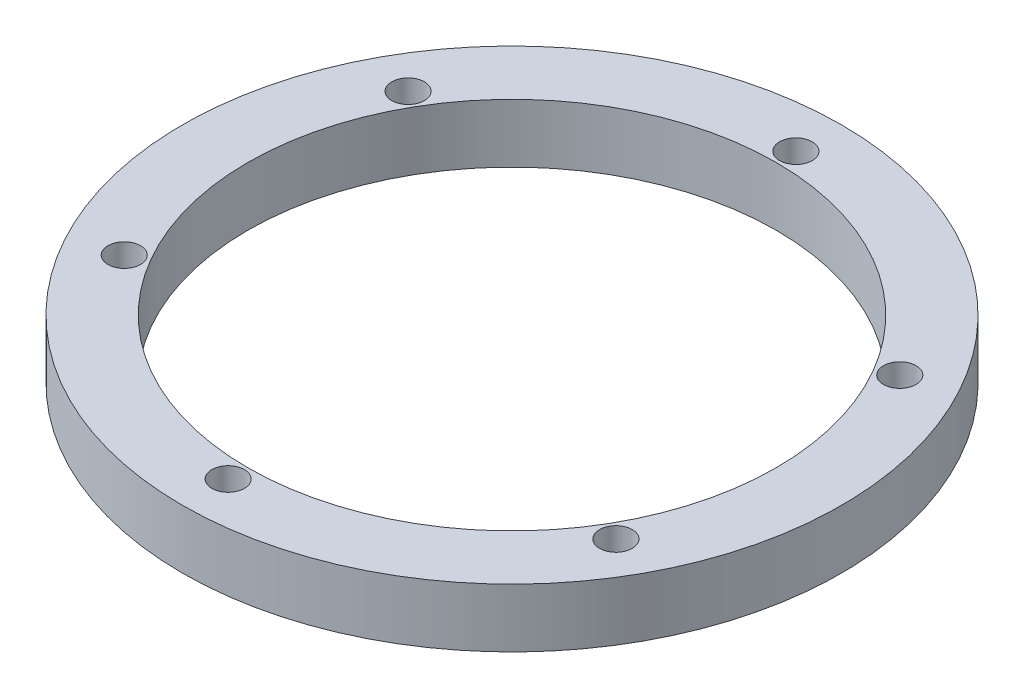
ISO-10303-21;
HEADER;
FILE_DESCRIPTION(('STEP AP214'),'2;1');
FILE_NAME('part.step','',(''),(''),'','','');
FILE_SCHEMA(('AUTOMOTIVE_DESIGN { 1 0 10303 214 1 1 1 1 }'));
ENDSEC;
DATA;
#1=APPLICATION_CONTEXT('core data for automotive mechanical design processes');
#2=APPLICATION_PROTOCOL_DEFINITION('international standard','automotive_design',2000,#1);
#3=PRODUCT_CONTEXT('',#1,'mechanical');
#4=PRODUCT('Part','Part','',(#3));
#5=PRODUCT_RELATED_PRODUCT_CATEGORY('part','',(#4));
#6=PRODUCT_DEFINITION_FORMATION('','',#4);
#7=PRODUCT_DEFINITION_CONTEXT('part definition',#1,'design');
#8=PRODUCT_DEFINITION('design','',#6,#7);
#9=PRODUCT_DEFINITION_SHAPE('','',#8);
#10=(LENGTH_UNIT() NAMED_UNIT(*) SI_UNIT(.MILLI.,.METRE.));
#11=(NAMED_UNIT(*) PLANE_ANGLE_UNIT() SI_UNIT($,.RADIAN.));
#12=(NAMED_UNIT(*) SI_UNIT($,.STERADIAN.) SOLID_ANGLE_UNIT());
#13=UNCERTAINTY_MEASURE_WITH_UNIT(LENGTH_MEASURE(1.E-05),#10,'distance_accuracy_value','');
#14=(GEOMETRIC_REPRESENTATION_CONTEXT(3) GLOBAL_UNCERTAINTY_ASSIGNED_CONTEXT((#13)) GLOBAL_UNIT_ASSIGNED_CONTEXT((#10,
#11,#12)) REPRESENTATION_CONTEXT('',''));
#15=CARTESIAN_POINT('',(0.,0.,0.));
#16=DIRECTION('',(0.,0.,1.));
#17=DIRECTION('',(1.,0.,0.));
#18=AXIS2_PLACEMENT_3D('',#15,#16,#17);
#19=CARTESIAN_POINT('',(0.,9.,0.));
#20=DIRECTION('',(0.,1.,0.));
#21=DIRECTION('',(0.,0.,1.));
#22=AXIS2_PLACEMENT_3D('',#19,#20,#21);
#23=PLANE('',#22);
#24=CARTESIAN_POINT('',(0.,9.,-43.5));
#25=DIRECTION('',(0.,1.,0.));
#26=DIRECTION('',(0.,0.,1.));
#27=AXIS2_PLACEMENT_3D('',#24,#25,#26);
#28=CIRCLE('',#27,2.5);
#29=CARTESIAN_POINT('',(0.,9.,-41.));
#30=VERTEX_POINT('',#29);
#31=EDGE_CURVE('E99',#30,#30,#28,.T.);
#32=ORIENTED_EDGE('',*,*,#31,.F.);
#33=EDGE_LOOP('',(#32));
#34=FACE_BOUND('',#33,.T.);
#35=CARTESIAN_POINT('',(-37.6721050646231,9.,-21.75));
#36=DIRECTION('',(0.,1.,0.));
#37=DIRECTION('',(0.,0.,1.));
#38=AXIS2_PLACEMENT_3D('',#35,#36,#37);
#39=CIRCLE('',#38,2.5);
#40=CARTESIAN_POINT('',(-37.6721050646231,9.,-19.25));
#41=VERTEX_POINT('',#40);
#42=EDGE_CURVE('E100',#41,#41,#39,.T.);
#43=ORIENTED_EDGE('',*,*,#42,.F.);
#44=EDGE_LOOP('',(#43));
#45=FACE_BOUND('',#44,.T.);
#46=CARTESIAN_POINT('',(-37.6721050646231,9.,21.75));
#47=DIRECTION('',(0.,1.,0.));
#48=DIRECTION('',(0.,0.,1.));
#49=AXIS2_PLACEMENT_3D('',#46,#47,#48);
#50=CIRCLE('',#49,2.5);
#51=CARTESIAN_POINT('',(-37.6721050646231,9.,24.25));
#52=VERTEX_POINT('',#51);
#53=EDGE_CURVE('E66',#52,#52,#50,.T.);
#54=ORIENTED_EDGE('',*,*,#53,.F.);
#55=EDGE_LOOP('',(#54));
#56=FACE_BOUND('',#55,.T.);
#57=CARTESIAN_POINT('',(0.,9.,43.5));
#58=DIRECTION('',(0.,1.,0.));
#59=DIRECTION('',(0.,0.,1.));
#60=AXIS2_PLACEMENT_3D('',#57,#58,#59);
#61=CIRCLE('',#60,2.5);
#62=CARTESIAN_POINT('',(0.,9.,46.));
#63=VERTEX_POINT('',#62);
#64=EDGE_CURVE('E75',#63,#63,#61,.T.);
#65=ORIENTED_EDGE('',*,*,#64,.F.);
#66=EDGE_LOOP('',(#65));
#67=FACE_BOUND('',#66,.T.);
#68=CARTESIAN_POINT('',(37.6721050646231,9.,21.75));
#69=DIRECTION('',(0.,1.,0.));
#70=DIRECTION('',(0.,0.,1.));
#71=AXIS2_PLACEMENT_3D('',#68,#69,#70);
#72=CIRCLE('',#71,2.5);
#73=CARTESIAN_POINT('',(37.6721050646231,9.,24.25));
#74=VERTEX_POINT('',#73);
#75=EDGE_CURVE('E83',#74,#74,#72,.T.);
#76=ORIENTED_EDGE('',*,*,#75,.F.);
#77=EDGE_LOOP('',(#76));
#78=FACE_BOUND('',#77,.T.);
#79=CARTESIAN_POINT('',(37.6721050646231,9.,-21.75));
#80=DIRECTION('',(0.,1.,0.));
#81=DIRECTION('',(0.,0.,1.));
#82=AXIS2_PLACEMENT_3D('',#79,#80,#81);
#83=CIRCLE('',#82,2.5);
#84=CARTESIAN_POINT('',(37.6721050646231,9.,-19.25));
#85=VERTEX_POINT('',#84);
#86=EDGE_CURVE('E91',#85,#85,#83,.T.);
#87=ORIENTED_EDGE('',*,*,#86,.F.);
#88=EDGE_LOOP('',(#87));
#89=FACE_BOUND('',#88,.T.);
#90=CARTESIAN_POINT('',(0.,9.,0.));
#91=DIRECTION('',(0.,1.,0.));
#92=DIRECTION('',(0.,0.,1.));
#93=AXIS2_PLACEMENT_3D('',#90,#91,#92);
#94=CIRCLE('',#93,50.5);
#95=CARTESIAN_POINT('',(0.,9.,50.5));
#96=VERTEX_POINT('',#95);
#97=EDGE_CURVE('E10',#96,#96,#94,.T.);
#98=ORIENTED_EDGE('',*,*,#97,.T.);
#99=EDGE_LOOP('',(#98));
#100=FACE_BOUND('',#99,.T.);
#101=CARTESIAN_POINT('',(0.,9.,0.));
#102=DIRECTION('',(0.,1.,0.));
#103=DIRECTION('',(0.,0.,1.));
#104=AXIS2_PLACEMENT_3D('',#101,#102,#103);
#105=CIRCLE('',#104,40.5);
#106=CARTESIAN_POINT('',(0.,9.,40.5));
#107=VERTEX_POINT('',#106);
#108=EDGE_CURVE('E56',#107,#107,#105,.T.);
#109=ORIENTED_EDGE('',*,*,#108,.F.);
#110=EDGE_LOOP('',(#109));
#111=FACE_BOUND('',#110,.T.);
#112=ADVANCED_FACE('F43',(#34,#45,#56,#67,#78,#89,#100,#111),#23,.T.);
#113=CARTESIAN_POINT('',(0.,0.,0.));
#114=DIRECTION('',(0.,1.,0.));
#115=DIRECTION('',(0.,0.,1.));
#116=AXIS2_PLACEMENT_3D('',#113,#114,#115);
#117=PLANE('',#116);
#118=CARTESIAN_POINT('',(0.,0.,-43.5));
#119=DIRECTION('',(0.,1.,0.));
#120=DIRECTION('',(0.,0.,1.));
#121=AXIS2_PLACEMENT_3D('',#118,#119,#120);
#122=CIRCLE('',#121,2.5);
#123=CARTESIAN_POINT('',(0.,0.,-41.));
#124=VERTEX_POINT('',#123);
#125=EDGE_CURVE('E62',#124,#124,#122,.T.);
#126=ORIENTED_EDGE('',*,*,#125,.T.);
#127=EDGE_LOOP('',(#126));
#128=FACE_BOUND('',#127,.T.);
#129=CARTESIAN_POINT('',(-37.6721050646231,0.,-21.75));
#130=DIRECTION('',(0.,1.,0.));
#131=DIRECTION('',(0.,0.,1.));
#132=AXIS2_PLACEMENT_3D('',#129,#130,#131);
#133=CIRCLE('',#132,2.5);
#134=CARTESIAN_POINT('',(-37.6721050646231,0.,-19.25));
#135=VERTEX_POINT('',#134);
#136=EDGE_CURVE('E71',#135,#135,#133,.T.);
#137=ORIENTED_EDGE('',*,*,#136,.T.);
#138=EDGE_LOOP('',(#137));
#139=FACE_BOUND('',#138,.T.);
#140=CARTESIAN_POINT('',(-37.6721050646231,0.,21.75));
#141=DIRECTION('',(0.,1.,0.));
#142=DIRECTION('',(0.,0.,1.));
#143=AXIS2_PLACEMENT_3D('',#140,#141,#142);
#144=CIRCLE('',#143,2.5);
#145=CARTESIAN_POINT('',(-37.6721050646231,0.,24.25));
#146=VERTEX_POINT('',#145);
#147=EDGE_CURVE('E70',#146,#146,#144,.T.);
#148=ORIENTED_EDGE('',*,*,#147,.T.);
#149=EDGE_LOOP('',(#148));
#150=FACE_BOUND('',#149,.T.);
#151=CARTESIAN_POINT('',(0.,0.,43.5));
#152=DIRECTION('',(0.,1.,0.));
#153=DIRECTION('',(0.,0.,1.));
#154=AXIS2_PLACEMENT_3D('',#151,#152,#153);
#155=CIRCLE('',#154,2.5);
#156=CARTESIAN_POINT('',(0.,0.,46.));
#157=VERTEX_POINT('',#156);
#158=EDGE_CURVE('E79',#157,#157,#155,.T.);
#159=ORIENTED_EDGE('',*,*,#158,.T.);
#160=EDGE_LOOP('',(#159));
#161=FACE_BOUND('',#160,.T.);
#162=CARTESIAN_POINT('',(37.6721050646231,0.,21.75));
#163=DIRECTION('',(0.,1.,0.));
#164=DIRECTION('',(0.,0.,1.));
#165=AXIS2_PLACEMENT_3D('',#162,#163,#164);
#166=CIRCLE('',#165,2.5);
#167=CARTESIAN_POINT('',(37.6721050646231,0.,24.25));
#168=VERTEX_POINT('',#167);
#169=EDGE_CURVE('E87',#168,#168,#166,.T.);
#170=ORIENTED_EDGE('',*,*,#169,.T.);
#171=EDGE_LOOP('',(#170));
#172=FACE_BOUND('',#171,.T.);
#173=CARTESIAN_POINT('',(37.6721050646231,0.,-21.75));
#174=DIRECTION('',(0.,1.,0.));
#175=DIRECTION('',(0.,0.,1.));
#176=AXIS2_PLACEMENT_3D('',#173,#174,#175);
#177=CIRCLE('',#176,2.5);
#178=CARTESIAN_POINT('',(37.6721050646231,0.,-19.25));
#179=VERTEX_POINT('',#178);
#180=EDGE_CURVE('E95',#179,#179,#177,.T.);
#181=ORIENTED_EDGE('',*,*,#180,.T.);
#182=EDGE_LOOP('',(#181));
#183=FACE_BOUND('',#182,.T.);
#184=CARTESIAN_POINT('',(0.,0.,0.));
#185=DIRECTION('',(0.,1.,0.));
#186=DIRECTION('',(0.,0.,1.));
#187=AXIS2_PLACEMENT_3D('',#184,#185,#186);
#188=CIRCLE('',#187,50.5);
#189=CARTESIAN_POINT('',(0.,0.,50.5));
#190=VERTEX_POINT('',#189);
#191=EDGE_CURVE('E47',#190,#190,#188,.T.);
#192=ORIENTED_EDGE('',*,*,#191,.F.);
#193=EDGE_LOOP('',(#192));
#194=FACE_BOUND('',#193,.T.);
#195=CARTESIAN_POINT('',(0.,0.,0.));
#196=DIRECTION('',(0.,1.,0.));
#197=DIRECTION('',(0.,0.,1.));
#198=AXIS2_PLACEMENT_3D('',#195,#196,#197);
#199=CIRCLE('',#198,40.5);
#200=CARTESIAN_POINT('',(0.,0.,40.5));
#201=VERTEX_POINT('',#200);
#202=EDGE_CURVE('E58',#201,#201,#199,.T.);
#203=ORIENTED_EDGE('',*,*,#202,.T.);
#204=EDGE_LOOP('',(#203));
#205=FACE_BOUND('',#204,.T.);
#206=ADVANCED_FACE('F114',(#128,#139,#150,#161,#172,#183,#194,#205),#117,.F.);
#207=CARTESIAN_POINT('',(0.,9.,0.));
#208=DIRECTION('',(0.,-1.,0.));
#209=DIRECTION('',(0.,0.,-1.));
#210=AXIS2_PLACEMENT_3D('',#207,#208,#209);
#211=CYLINDRICAL_SURFACE('',#210,50.5);
#212=ORIENTED_EDGE('',*,*,#97,.F.);
#213=EDGE_LOOP('',(#212));
#214=FACE_BOUND('',#213,.T.);
#215=ORIENTED_EDGE('',*,*,#191,.T.);
#216=EDGE_LOOP('',(#215));
#217=FACE_BOUND('',#216,.T.);
#218=ADVANCED_FACE('F45',(#214,#217),#211,.T.);
#219=CARTESIAN_POINT('',(0.,9.,0.));
#220=DIRECTION('',(0.,-1.,0.));
#221=DIRECTION('',(0.,0.,-1.));
#222=AXIS2_PLACEMENT_3D('',#219,#220,#221);
#223=CYLINDRICAL_SURFACE('',#222,40.5);
#224=ORIENTED_EDGE('',*,*,#108,.T.);
#225=EDGE_LOOP('',(#224));
#226=FACE_BOUND('',#225,.T.);
#227=ORIENTED_EDGE('',*,*,#202,.F.);
#228=EDGE_LOOP('',(#227));
#229=FACE_BOUND('',#228,.T.);
#230=ADVANCED_FACE('F139',(#226,#229),#223,.F.);
#231=CARTESIAN_POINT('',(37.6721050646231,0.,-21.75));
#232=DIRECTION('',(0.,1.,0.));
#233=DIRECTION('',(0.,0.,1.));
#234=AXIS2_PLACEMENT_3D('',#231,#232,#233);
#235=CYLINDRICAL_SURFACE('',#234,2.5);
#236=ORIENTED_EDGE('',*,*,#180,.F.);
#237=EDGE_LOOP('',(#236));
#238=FACE_BOUND('',#237,.T.);
#239=ORIENTED_EDGE('',*,*,#86,.T.);
#240=EDGE_LOOP('',(#239));
#241=FACE_BOUND('',#240,.T.);
#242=ADVANCED_FACE('F142',(#238,#241),#235,.F.);
#243=CARTESIAN_POINT('',(37.6721050646231,0.,21.75));
#244=DIRECTION('',(0.,1.,0.));
#245=DIRECTION('',(0.,0.,1.));
#246=AXIS2_PLACEMENT_3D('',#243,#244,#245);
#247=CYLINDRICAL_SURFACE('',#246,2.5);
#248=ORIENTED_EDGE('',*,*,#169,.F.);
#249=EDGE_LOOP('',(#248));
#250=FACE_BOUND('',#249,.T.);
#251=ORIENTED_EDGE('',*,*,#75,.T.);
#252=EDGE_LOOP('',(#251));
#253=FACE_BOUND('',#252,.T.);
#254=ADVANCED_FACE('F160',(#250,#253),#247,.F.);
#255=CARTESIAN_POINT('',(0.,0.,43.5));
#256=DIRECTION('',(0.,1.,0.));
#257=DIRECTION('',(0.,0.,1.));
#258=AXIS2_PLACEMENT_3D('',#255,#256,#257);
#259=CYLINDRICAL_SURFACE('',#258,2.5);
#260=ORIENTED_EDGE('',*,*,#158,.F.);
#261=EDGE_LOOP('',(#260));
#262=FACE_BOUND('',#261,.T.);
#263=ORIENTED_EDGE('',*,*,#64,.T.);
#264=EDGE_LOOP('',(#263));
#265=FACE_BOUND('',#264,.T.);
#266=ADVANCED_FACE('F156',(#262,#265),#259,.F.);
#267=CARTESIAN_POINT('',(-37.6721050646231,0.,21.75));
#268=DIRECTION('',(0.,1.,0.));
#269=DIRECTION('',(0.,0.,1.));
#270=AXIS2_PLACEMENT_3D('',#267,#268,#269);
#271=CYLINDRICAL_SURFACE('',#270,2.5);
#272=ORIENTED_EDGE('',*,*,#147,.F.);
#273=EDGE_LOOP('',(#272));
#274=FACE_BOUND('',#273,.T.);
#275=ORIENTED_EDGE('',*,*,#53,.T.);
#276=EDGE_LOOP('',(#275));
#277=FACE_BOUND('',#276,.T.);
#278=ADVANCED_FACE('F153',(#274,#277),#271,.F.);
#279=CARTESIAN_POINT('',(-37.6721050646231,0.,-21.75));
#280=DIRECTION('',(0.,1.,0.));
#281=DIRECTION('',(0.,0.,1.));
#282=AXIS2_PLACEMENT_3D('',#279,#280,#281);
#283=CYLINDRICAL_SURFACE('',#282,2.5);
#284=ORIENTED_EDGE('',*,*,#136,.F.);
#285=EDGE_LOOP('',(#284));
#286=FACE_BOUND('',#285,.T.);
#287=ORIENTED_EDGE('',*,*,#42,.T.);
#288=EDGE_LOOP('',(#287));
#289=FACE_BOUND('',#288,.T.);
#290=ADVANCED_FACE('F120',(#286,#289),#283,.F.);
#291=CARTESIAN_POINT('',(0.,0.,-43.5));
#292=DIRECTION('',(0.,1.,0.));
#293=DIRECTION('',(0.,0.,1.));
#294=AXIS2_PLACEMENT_3D('',#291,#292,#293);
#295=CYLINDRICAL_SURFACE('',#294,2.5);
#296=ORIENTED_EDGE('',*,*,#125,.F.);
#297=EDGE_LOOP('',(#296));
#298=FACE_BOUND('',#297,.T.);
#299=ORIENTED_EDGE('',*,*,#31,.T.);
#300=EDGE_LOOP('',(#299));
#301=FACE_BOUND('',#300,.T.);
#302=ADVANCED_FACE('F117',(#298,#301),#295,.F.);
#303=CLOSED_SHELL('',(#112,#206,#218,#230,#242,#254,#266,#278,#290,#302));
#304=MANIFOLD_SOLID_BREP('B2',#303);
#305=ADVANCED_BREP_SHAPE_REPRESENTATION('',(#18,#304),#14);
#306=SHAPE_DEFINITION_REPRESENTATION(#9,#305);
ENDSEC;
END-ISO-10303-21;
